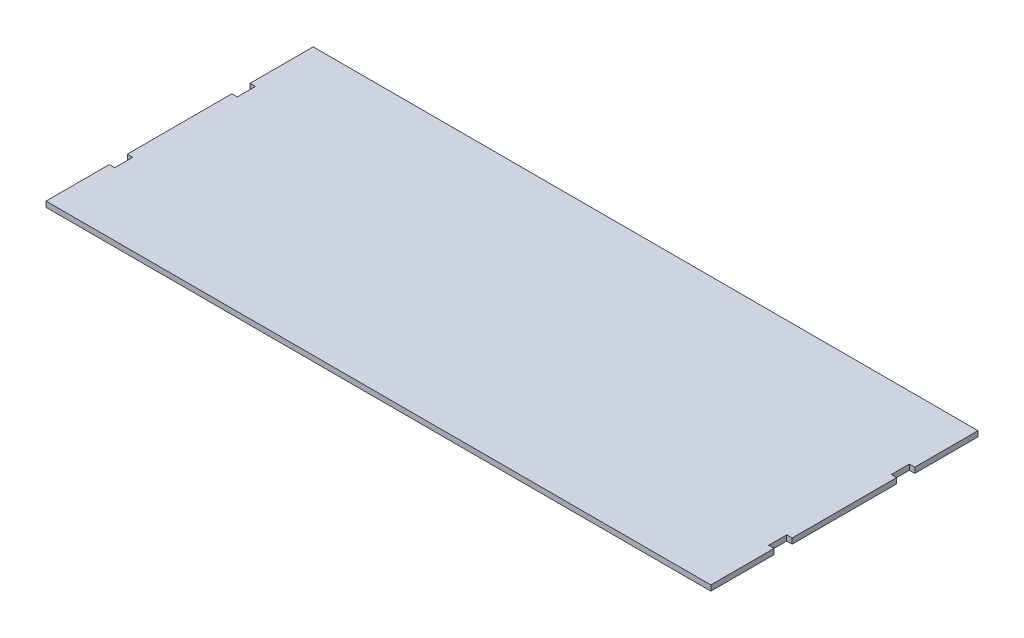
ISO-10303-21;
HEADER;
FILE_DESCRIPTION(('STEP AP214'),'2;1');
FILE_NAME('part.step','',(''),(''),'','','');
FILE_SCHEMA(('AUTOMOTIVE_DESIGN { 1 0 10303 214 1 1 1 1 }'));
ENDSEC;
DATA;
#1=APPLICATION_CONTEXT('core data for automotive mechanical design processes');
#2=APPLICATION_PROTOCOL_DEFINITION('international standard','automotive_design',2000,#1);
#3=PRODUCT_CONTEXT('',#1,'mechanical');
#4=PRODUCT('Part','Part','',(#3));
#5=PRODUCT_RELATED_PRODUCT_CATEGORY('part','',(#4));
#6=PRODUCT_DEFINITION_FORMATION('','',#4);
#7=PRODUCT_DEFINITION_CONTEXT('part definition',#1,'design');
#8=PRODUCT_DEFINITION('design','',#6,#7);
#9=PRODUCT_DEFINITION_SHAPE('','',#8);
#10=(LENGTH_UNIT() NAMED_UNIT(*) SI_UNIT(.MILLI.,.METRE.));
#11=(NAMED_UNIT(*) PLANE_ANGLE_UNIT() SI_UNIT($,.RADIAN.));
#12=(NAMED_UNIT(*) SI_UNIT($,.STERADIAN.) SOLID_ANGLE_UNIT());
#13=UNCERTAINTY_MEASURE_WITH_UNIT(LENGTH_MEASURE(1.E-05),#10,'distance_accuracy_value','');
#14=(GEOMETRIC_REPRESENTATION_CONTEXT(3) GLOBAL_UNCERTAINTY_ASSIGNED_CONTEXT((#13)) GLOBAL_UNIT_ASSIGNED_CONTEXT((#10,
#11,#12)) REPRESENTATION_CONTEXT('',''));
#15=CARTESIAN_POINT('',(0.,0.,0.));
#16=DIRECTION('',(0.,0.,1.));
#17=DIRECTION('',(1.,0.,0.));
#18=AXIS2_PLACEMENT_3D('',#15,#16,#17);
#19=CARTESIAN_POINT('',(-184.,3.,-38.945));
#20=DIRECTION('',(1.,0.,0.));
#21=DIRECTION('',(0.,0.,-1.));
#22=AXIS2_PLACEMENT_3D('',#19,#20,#21);
#23=PLANE('',#22);
#24=DIRECTION('',(0.,0.,1.));
#25=VECTOR('',#24,1.);
#26=CARTESIAN_POINT('',(-184.,0.,-38.945));
#27=LINE('',#26,#25);
#28=CARTESIAN_POINT('',(-184.,0.,-73.945));
#29=VERTEX_POINT('',#28);
#30=CARTESIAN_POINT('',(-184.,0.,-38.945));
#31=VERTEX_POINT('',#30);
#32=EDGE_CURVE('E212',#29,#31,#27,.T.);
#33=ORIENTED_EDGE('',*,*,#32,.T.);
#34=DIRECTION('',(0.,-1.,0.));
#35=VECTOR('',#34,1.);
#36=CARTESIAN_POINT('',(-184.,3.,-38.945));
#37=LINE('',#36,#35);
#38=CARTESIAN_POINT('',(-184.,3.,-38.945));
#39=VERTEX_POINT('',#38);
#40=EDGE_CURVE('E11',#39,#31,#37,.T.);
#41=ORIENTED_EDGE('',*,*,#40,.F.);
#42=DIRECTION('',(0.,0.,1.));
#43=VECTOR('',#42,1.);
#44=CARTESIAN_POINT('',(-184.,3.,-38.945));
#45=LINE('',#44,#43);
#46=CARTESIAN_POINT('',(-184.,3.,-73.945));
#47=VERTEX_POINT('',#46);
#48=EDGE_CURVE('E270',#47,#39,#45,.T.);
#49=ORIENTED_EDGE('',*,*,#48,.F.);
#50=DIRECTION('',(0.,-1.,0.));
#51=VECTOR('',#50,1.);
#52=CARTESIAN_POINT('',(-184.,3.,-73.945));
#53=LINE('',#52,#51);
#54=EDGE_CURVE('E208',#47,#29,#53,.T.);
#55=ORIENTED_EDGE('',*,*,#54,.T.);
#56=EDGE_LOOP('',(#33,#41,#49,#55));
#57=FACE_BOUND('',#56,.T.);
#58=ADVANCED_FACE('F39',(#57),#23,.F.);
#59=CARTESIAN_POINT('',(-184.,3.,-38.945));
#60=DIRECTION('',(0.,0.,-1.));
#61=DIRECTION('',(-1.,0.,0.));
#62=AXIS2_PLACEMENT_3D('',#59,#60,#61);
#63=PLANE('',#62);
#64=DIRECTION('',(1.,0.,0.));
#65=VECTOR('',#64,1.);
#66=CARTESIAN_POINT('',(-184.,0.,-38.945));
#67=LINE('',#66,#65);
#68=CARTESIAN_POINT('',(-181.,0.,-38.945));
#69=VERTEX_POINT('',#68);
#70=EDGE_CURVE('E216',#31,#69,#67,.T.);
#71=ORIENTED_EDGE('',*,*,#70,.T.);
#72=DIRECTION('',(0.,-1.,0.));
#73=VECTOR('',#72,1.);
#74=CARTESIAN_POINT('',(-181.,3.,-38.945));
#75=LINE('',#74,#73);
#76=CARTESIAN_POINT('',(-181.,3.,-38.945));
#77=VERTEX_POINT('',#76);
#78=EDGE_CURVE('E48',#77,#69,#75,.T.);
#79=ORIENTED_EDGE('',*,*,#78,.F.);
#80=DIRECTION('',(1.,0.,0.));
#81=VECTOR('',#80,1.);
#82=CARTESIAN_POINT('',(-184.,3.,-38.945));
#83=LINE('',#82,#81);
#84=EDGE_CURVE('E135',#39,#77,#83,.T.);
#85=ORIENTED_EDGE('',*,*,#84,.F.);
#86=ORIENTED_EDGE('',*,*,#40,.T.);
#87=EDGE_LOOP('',(#71,#79,#85,#86));
#88=FACE_BOUND('',#87,.T.);
#89=ADVANCED_FACE('F420',(#88),#63,.F.);
#90=CARTESIAN_POINT('',(-181.,3.,-38.945));
#91=DIRECTION('',(1.,0.,0.));
#92=DIRECTION('',(0.,0.,-1.));
#93=AXIS2_PLACEMENT_3D('',#90,#91,#92);
#94=PLANE('',#93);
#95=DIRECTION('',(0.,0.,1.));
#96=VECTOR('',#95,1.);
#97=CARTESIAN_POINT('',(-181.,0.,-38.945));
#98=LINE('',#97,#96);
#99=CARTESIAN_POINT('',(-181.,0.,-28.945));
#100=VERTEX_POINT('',#99);
#101=EDGE_CURVE('E219',#69,#100,#98,.T.);
#102=ORIENTED_EDGE('',*,*,#101,.T.);
#103=DIRECTION('',(0.,-1.,0.));
#104=VECTOR('',#103,1.);
#105=CARTESIAN_POINT('',(-181.,3.,-28.945));
#106=LINE('',#105,#104);
#107=CARTESIAN_POINT('',(-181.,3.,-28.945));
#108=VERTEX_POINT('',#107);
#109=EDGE_CURVE('E329',#108,#100,#106,.T.);
#110=ORIENTED_EDGE('',*,*,#109,.F.);
#111=DIRECTION('',(0.,0.,1.));
#112=VECTOR('',#111,1.);
#113=CARTESIAN_POINT('',(-181.,3.,-38.945));
#114=LINE('',#113,#112);
#115=EDGE_CURVE('E339',#77,#108,#114,.T.);
#116=ORIENTED_EDGE('',*,*,#115,.F.);
#117=ORIENTED_EDGE('',*,*,#78,.T.);
#118=EDGE_LOOP('',(#102,#110,#116,#117));
#119=FACE_BOUND('',#118,.T.);
#120=ADVANCED_FACE('F337',(#119),#94,.F.);
#121=CARTESIAN_POINT('',(-181.,3.,-28.945));
#122=DIRECTION('',(0.,0.,1.));
#123=DIRECTION('',(1.,0.,0.));
#124=AXIS2_PLACEMENT_3D('',#121,#122,#123);
#125=PLANE('',#124);
#126=DIRECTION('',(-1.,0.,0.));
#127=VECTOR('',#126,1.);
#128=CARTESIAN_POINT('',(-181.,0.,-28.945));
#129=LINE('',#128,#127);
#130=CARTESIAN_POINT('',(-184.,0.,-28.945));
#131=VERTEX_POINT('',#130);
#132=EDGE_CURVE('E222',#100,#131,#129,.T.);
#133=ORIENTED_EDGE('',*,*,#132,.T.);
#134=DIRECTION('',(0.,-1.,0.));
#135=VECTOR('',#134,1.);
#136=CARTESIAN_POINT('',(-184.,3.,-28.945));
#137=LINE('',#136,#135);
#138=CARTESIAN_POINT('',(-184.,3.,-28.945));
#139=VERTEX_POINT('',#138);
#140=EDGE_CURVE('E325',#139,#131,#137,.T.);
#141=ORIENTED_EDGE('',*,*,#140,.F.);
#142=DIRECTION('',(-1.,0.,0.));
#143=VECTOR('',#142,1.);
#144=CARTESIAN_POINT('',(-181.,3.,-28.945));
#145=LINE('',#144,#143);
#146=EDGE_CURVE('E358',#108,#139,#145,.T.);
#147=ORIENTED_EDGE('',*,*,#146,.F.);
#148=ORIENTED_EDGE('',*,*,#109,.T.);
#149=EDGE_LOOP('',(#133,#141,#147,#148));
#150=FACE_BOUND('',#149,.T.);
#151=ADVANCED_FACE('F348',(#150),#125,.F.);
#152=CARTESIAN_POINT('',(-184.,3.,28.945));
#153=DIRECTION('',(1.,0.,0.));
#154=DIRECTION('',(0.,0.,-1.));
#155=AXIS2_PLACEMENT_3D('',#152,#153,#154);
#156=PLANE('',#155);
#157=DIRECTION('',(0.,0.,1.));
#158=VECTOR('',#157,1.);
#159=CARTESIAN_POINT('',(-184.,0.,28.945));
#160=LINE('',#159,#158);
#161=CARTESIAN_POINT('',(-184.,0.,28.945));
#162=VERTEX_POINT('',#161);
#163=EDGE_CURVE('E225',#131,#162,#160,.T.);
#164=ORIENTED_EDGE('',*,*,#163,.T.);
#165=DIRECTION('',(0.,-1.,0.));
#166=VECTOR('',#165,1.);
#167=CARTESIAN_POINT('',(-184.,3.,28.945));
#168=LINE('',#167,#166);
#169=CARTESIAN_POINT('',(-184.,3.,28.945));
#170=VERTEX_POINT('',#169);
#171=EDGE_CURVE('E321',#170,#162,#168,.T.);
#172=ORIENTED_EDGE('',*,*,#171,.F.);
#173=DIRECTION('',(0.,0.,1.));
#174=VECTOR('',#173,1.);
#175=CARTESIAN_POINT('',(-184.,3.,28.945));
#176=LINE('',#175,#174);
#177=EDGE_CURVE('E354',#139,#170,#176,.T.);
#178=ORIENTED_EDGE('',*,*,#177,.F.);
#179=ORIENTED_EDGE('',*,*,#140,.T.);
#180=EDGE_LOOP('',(#164,#172,#178,#179));
#181=FACE_BOUND('',#180,.T.);
#182=ADVANCED_FACE('F352',(#181),#156,.F.);
#183=CARTESIAN_POINT('',(-181.,3.,28.945));
#184=DIRECTION('',(0.,0.,-1.));
#185=DIRECTION('',(-1.,0.,0.));
#186=AXIS2_PLACEMENT_3D('',#183,#184,#185);
#187=PLANE('',#186);
#188=DIRECTION('',(1.,0.,0.));
#189=VECTOR('',#188,1.);
#190=CARTESIAN_POINT('',(-181.,0.,28.945));
#191=LINE('',#190,#189);
#192=CARTESIAN_POINT('',(-181.,0.,28.945));
#193=VERTEX_POINT('',#192);
#194=EDGE_CURVE('E228',#162,#193,#191,.T.);
#195=ORIENTED_EDGE('',*,*,#194,.T.);
#196=DIRECTION('',(0.,-1.,0.));
#197=VECTOR('',#196,1.);
#198=CARTESIAN_POINT('',(-181.,3.,28.945));
#199=LINE('',#198,#197);
#200=CARTESIAN_POINT('',(-181.,3.,28.945));
#201=VERTEX_POINT('',#200);
#202=EDGE_CURVE('E317',#201,#193,#199,.T.);
#203=ORIENTED_EDGE('',*,*,#202,.F.);
#204=DIRECTION('',(1.,0.,0.));
#205=VECTOR('',#204,1.);
#206=CARTESIAN_POINT('',(-181.,3.,28.945));
#207=LINE('',#206,#205);
#208=EDGE_CURVE('E357',#170,#201,#207,.T.);
#209=ORIENTED_EDGE('',*,*,#208,.F.);
#210=ORIENTED_EDGE('',*,*,#171,.T.);
#211=EDGE_LOOP('',(#195,#203,#209,#210));
#212=FACE_BOUND('',#211,.T.);
#213=ADVANCED_FACE('F433',(#212),#187,.F.);
#214=CARTESIAN_POINT('',(-181.,3.,38.945));
#215=DIRECTION('',(1.,0.,0.));
#216=DIRECTION('',(0.,0.,-1.));
#217=AXIS2_PLACEMENT_3D('',#214,#215,#216);
#218=PLANE('',#217);
#219=DIRECTION('',(0.,0.,1.));
#220=VECTOR('',#219,1.);
#221=CARTESIAN_POINT('',(-181.,0.,38.945));
#222=LINE('',#221,#220);
#223=CARTESIAN_POINT('',(-181.,0.,38.945));
#224=VERTEX_POINT('',#223);
#225=EDGE_CURVE('E231',#193,#224,#222,.T.);
#226=ORIENTED_EDGE('',*,*,#225,.T.);
#227=DIRECTION('',(0.,-1.,0.));
#228=VECTOR('',#227,1.);
#229=CARTESIAN_POINT('',(-181.,3.,38.945));
#230=LINE('',#229,#228);
#231=CARTESIAN_POINT('',(-181.,3.,38.945));
#232=VERTEX_POINT('',#231);
#233=EDGE_CURVE('E313',#232,#224,#230,.T.);
#234=ORIENTED_EDGE('',*,*,#233,.F.);
#235=DIRECTION('',(0.,0.,1.));
#236=VECTOR('',#235,1.);
#237=CARTESIAN_POINT('',(-181.,3.,38.945));
#238=LINE('',#237,#236);
#239=EDGE_CURVE('E362',#201,#232,#238,.T.);
#240=ORIENTED_EDGE('',*,*,#239,.F.);
#241=ORIENTED_EDGE('',*,*,#202,.T.);
#242=EDGE_LOOP('',(#226,#234,#240,#241));
#243=FACE_BOUND('',#242,.T.);
#244=ADVANCED_FACE('F436',(#243),#218,.F.);
#245=CARTESIAN_POINT('',(-184.,3.,38.945));
#246=DIRECTION('',(0.,0.,1.));
#247=DIRECTION('',(1.,0.,0.));
#248=AXIS2_PLACEMENT_3D('',#245,#246,#247);
#249=PLANE('',#248);
#250=DIRECTION('',(-1.,0.,0.));
#251=VECTOR('',#250,1.);
#252=CARTESIAN_POINT('',(-184.,0.,38.945));
#253=LINE('',#252,#251);
#254=CARTESIAN_POINT('',(-184.,0.,38.945));
#255=VERTEX_POINT('',#254);
#256=EDGE_CURVE('E234',#224,#255,#253,.T.);
#257=ORIENTED_EDGE('',*,*,#256,.T.);
#258=DIRECTION('',(0.,-1.,0.));
#259=VECTOR('',#258,1.);
#260=CARTESIAN_POINT('',(-184.,3.,38.945));
#261=LINE('',#260,#259);
#262=CARTESIAN_POINT('',(-184.,3.,38.945));
#263=VERTEX_POINT('',#262);
#264=EDGE_CURVE('E309',#263,#255,#261,.T.);
#265=ORIENTED_EDGE('',*,*,#264,.F.);
#266=DIRECTION('',(-1.,0.,0.));
#267=VECTOR('',#266,1.);
#268=CARTESIAN_POINT('',(-184.,3.,38.945));
#269=LINE('',#268,#267);
#270=EDGE_CURVE('E369',#232,#263,#269,.T.);
#271=ORIENTED_EDGE('',*,*,#270,.F.);
#272=ORIENTED_EDGE('',*,*,#233,.T.);
#273=EDGE_LOOP('',(#257,#265,#271,#272));
#274=FACE_BOUND('',#273,.T.);
#275=ADVANCED_FACE('F440',(#274),#249,.F.);
#276=CARTESIAN_POINT('',(-184.,3.,73.945));
#277=DIRECTION('',(1.,0.,0.));
#278=DIRECTION('',(0.,0.,-1.));
#279=AXIS2_PLACEMENT_3D('',#276,#277,#278);
#280=PLANE('',#279);
#281=DIRECTION('',(0.,0.,1.));
#282=VECTOR('',#281,1.);
#283=CARTESIAN_POINT('',(-184.,0.,73.945));
#284=LINE('',#283,#282);
#285=CARTESIAN_POINT('',(-184.,0.,73.945));
#286=VERTEX_POINT('',#285);
#287=EDGE_CURVE('E237',#255,#286,#284,.T.);
#288=ORIENTED_EDGE('',*,*,#287,.T.);
#289=DIRECTION('',(0.,-1.,0.));
#290=VECTOR('',#289,1.);
#291=CARTESIAN_POINT('',(-184.,3.,73.945));
#292=LINE('',#291,#290);
#293=CARTESIAN_POINT('',(-184.,3.,73.945));
#294=VERTEX_POINT('',#293);
#295=EDGE_CURVE('E305',#294,#286,#292,.T.);
#296=ORIENTED_EDGE('',*,*,#295,.F.);
#297=DIRECTION('',(0.,0.,1.));
#298=VECTOR('',#297,1.);
#299=CARTESIAN_POINT('',(-184.,3.,73.945));
#300=LINE('',#299,#298);
#301=EDGE_CURVE('E372',#263,#294,#300,.T.);
#302=ORIENTED_EDGE('',*,*,#301,.F.);
#303=ORIENTED_EDGE('',*,*,#264,.T.);
#304=EDGE_LOOP('',(#288,#296,#302,#303));
#305=FACE_BOUND('',#304,.T.);
#306=ADVANCED_FACE('F444',(#305),#280,.F.);
#307=CARTESIAN_POINT('',(184.,3.,73.945));
#308=DIRECTION('',(0.,0.,-1.));
#309=DIRECTION('',(-1.,0.,0.));
#310=AXIS2_PLACEMENT_3D('',#307,#308,#309);
#311=PLANE('',#310);
#312=DIRECTION('',(1.,0.,0.));
#313=VECTOR('',#312,1.);
#314=CARTESIAN_POINT('',(184.,0.,73.945));
#315=LINE('',#314,#313);
#316=CARTESIAN_POINT('',(184.,0.,73.945));
#317=VERTEX_POINT('',#316);
#318=EDGE_CURVE('E240',#286,#317,#315,.T.);
#319=ORIENTED_EDGE('',*,*,#318,.T.);
#320=DIRECTION('',(0.,-1.,0.));
#321=VECTOR('',#320,1.);
#322=CARTESIAN_POINT('',(184.,3.,73.945));
#323=LINE('',#322,#321);
#324=CARTESIAN_POINT('',(184.,3.,73.945));
#325=VERTEX_POINT('',#324);
#326=EDGE_CURVE('E301',#325,#317,#323,.T.);
#327=ORIENTED_EDGE('',*,*,#326,.F.);
#328=DIRECTION('',(1.,0.,0.));
#329=VECTOR('',#328,1.);
#330=CARTESIAN_POINT('',(184.,3.,73.945));
#331=LINE('',#330,#329);
#332=EDGE_CURVE('E375',#294,#325,#331,.T.);
#333=ORIENTED_EDGE('',*,*,#332,.F.);
#334=ORIENTED_EDGE('',*,*,#295,.T.);
#335=EDGE_LOOP('',(#319,#327,#333,#334));
#336=FACE_BOUND('',#335,.T.);
#337=ADVANCED_FACE('F448',(#336),#311,.F.);
#338=CARTESIAN_POINT('',(184.,3.,73.945));
#339=DIRECTION('',(-1.,0.,0.));
#340=DIRECTION('',(0.,0.,1.));
#341=AXIS2_PLACEMENT_3D('',#338,#339,#340);
#342=PLANE('',#341);
#343=DIRECTION('',(0.,0.,-1.));
#344=VECTOR('',#343,1.);
#345=CARTESIAN_POINT('',(184.,0.,73.945));
#346=LINE('',#345,#344);
#347=CARTESIAN_POINT('',(184.,0.,38.945));
#348=VERTEX_POINT('',#347);
#349=EDGE_CURVE('E243',#317,#348,#346,.T.);
#350=ORIENTED_EDGE('',*,*,#349,.T.);
#351=DIRECTION('',(0.,-1.,0.));
#352=VECTOR('',#351,1.);
#353=CARTESIAN_POINT('',(184.,3.,38.945));
#354=LINE('',#353,#352);
#355=CARTESIAN_POINT('',(184.,3.,38.945));
#356=VERTEX_POINT('',#355);
#357=EDGE_CURVE('E297',#356,#348,#354,.T.);
#358=ORIENTED_EDGE('',*,*,#357,.F.);
#359=DIRECTION('',(0.,0.,-1.));
#360=VECTOR('',#359,1.);
#361=CARTESIAN_POINT('',(184.,3.,73.945));
#362=LINE('',#361,#360);
#363=EDGE_CURVE('E378',#325,#356,#362,.T.);
#364=ORIENTED_EDGE('',*,*,#363,.F.);
#365=ORIENTED_EDGE('',*,*,#326,.T.);
#366=EDGE_LOOP('',(#350,#358,#364,#365));
#367=FACE_BOUND('',#366,.T.);
#368=ADVANCED_FACE('F452',(#367),#342,.F.);
#369=CARTESIAN_POINT('',(184.,3.,38.945));
#370=DIRECTION('',(0.,0.,1.));
#371=DIRECTION('',(1.,0.,0.));
#372=AXIS2_PLACEMENT_3D('',#369,#370,#371);
#373=PLANE('',#372);
#374=DIRECTION('',(-1.,0.,0.));
#375=VECTOR('',#374,1.);
#376=CARTESIAN_POINT('',(184.,0.,38.945));
#377=LINE('',#376,#375);
#378=CARTESIAN_POINT('',(181.,0.,38.945));
#379=VERTEX_POINT('',#378);
#380=EDGE_CURVE('E246',#348,#379,#377,.T.);
#381=ORIENTED_EDGE('',*,*,#380,.T.);
#382=DIRECTION('',(0.,-1.,0.));
#383=VECTOR('',#382,1.);
#384=CARTESIAN_POINT('',(181.,3.,38.945));
#385=LINE('',#384,#383);
#386=CARTESIAN_POINT('',(181.,3.,38.945));
#387=VERTEX_POINT('',#386);
#388=EDGE_CURVE('E293',#387,#379,#385,.T.);
#389=ORIENTED_EDGE('',*,*,#388,.F.);
#390=DIRECTION('',(-1.,0.,0.));
#391=VECTOR('',#390,1.);
#392=CARTESIAN_POINT('',(184.,3.,38.945));
#393=LINE('',#392,#391);
#394=EDGE_CURVE('E381',#356,#387,#393,.T.);
#395=ORIENTED_EDGE('',*,*,#394,.F.);
#396=ORIENTED_EDGE('',*,*,#357,.T.);
#397=EDGE_LOOP('',(#381,#389,#395,#396));
#398=FACE_BOUND('',#397,.T.);
#399=ADVANCED_FACE('F456',(#398),#373,.F.);
#400=CARTESIAN_POINT('',(181.,3.,38.945));
#401=DIRECTION('',(-1.,0.,0.));
#402=DIRECTION('',(0.,0.,1.));
#403=AXIS2_PLACEMENT_3D('',#400,#401,#402);
#404=PLANE('',#403);
#405=DIRECTION('',(0.,0.,-1.));
#406=VECTOR('',#405,1.);
#407=CARTESIAN_POINT('',(181.,0.,38.945));
#408=LINE('',#407,#406);
#409=CARTESIAN_POINT('',(181.,0.,28.945));
#410=VERTEX_POINT('',#409);
#411=EDGE_CURVE('E249',#379,#410,#408,.T.);
#412=ORIENTED_EDGE('',*,*,#411,.T.);
#413=DIRECTION('',(0.,-1.,0.));
#414=VECTOR('',#413,1.);
#415=CARTESIAN_POINT('',(181.,3.,28.945));
#416=LINE('',#415,#414);
#417=CARTESIAN_POINT('',(181.,3.,28.945));
#418=VERTEX_POINT('',#417);
#419=EDGE_CURVE('E289',#418,#410,#416,.T.);
#420=ORIENTED_EDGE('',*,*,#419,.F.);
#421=DIRECTION('',(0.,0.,-1.));
#422=VECTOR('',#421,1.);
#423=CARTESIAN_POINT('',(181.,3.,38.945));
#424=LINE('',#423,#422);
#425=EDGE_CURVE('E384',#387,#418,#424,.T.);
#426=ORIENTED_EDGE('',*,*,#425,.F.);
#427=ORIENTED_EDGE('',*,*,#388,.T.);
#428=EDGE_LOOP('',(#412,#420,#426,#427));
#429=FACE_BOUND('',#428,.T.);
#430=ADVANCED_FACE('F460',(#429),#404,.F.);
#431=CARTESIAN_POINT('',(181.,3.,28.945));
#432=DIRECTION('',(0.,0.,-1.));
#433=DIRECTION('',(-1.,0.,0.));
#434=AXIS2_PLACEMENT_3D('',#431,#432,#433);
#435=PLANE('',#434);
#436=DIRECTION('',(1.,0.,0.));
#437=VECTOR('',#436,1.);
#438=CARTESIAN_POINT('',(181.,0.,28.945));
#439=LINE('',#438,#437);
#440=CARTESIAN_POINT('',(184.,0.,28.945));
#441=VERTEX_POINT('',#440);
#442=EDGE_CURVE('E252',#410,#441,#439,.T.);
#443=ORIENTED_EDGE('',*,*,#442,.T.);
#444=DIRECTION('',(0.,-1.,0.));
#445=VECTOR('',#444,1.);
#446=CARTESIAN_POINT('',(184.,3.,28.945));
#447=LINE('',#446,#445);
#448=CARTESIAN_POINT('',(184.,3.,28.945));
#449=VERTEX_POINT('',#448);
#450=EDGE_CURVE('E285',#449,#441,#447,.T.);
#451=ORIENTED_EDGE('',*,*,#450,.F.);
#452=DIRECTION('',(1.,0.,0.));
#453=VECTOR('',#452,1.);
#454=CARTESIAN_POINT('',(181.,3.,28.945));
#455=LINE('',#454,#453);
#456=EDGE_CURVE('E387',#418,#449,#455,.T.);
#457=ORIENTED_EDGE('',*,*,#456,.F.);
#458=ORIENTED_EDGE('',*,*,#419,.T.);
#459=EDGE_LOOP('',(#443,#451,#457,#458));
#460=FACE_BOUND('',#459,.T.);
#461=ADVANCED_FACE('F464',(#460),#435,.F.);
#462=CARTESIAN_POINT('',(184.,3.,28.945));
#463=DIRECTION('',(-1.,0.,0.));
#464=DIRECTION('',(0.,0.,1.));
#465=AXIS2_PLACEMENT_3D('',#462,#463,#464);
#466=PLANE('',#465);
#467=DIRECTION('',(0.,0.,-1.));
#468=VECTOR('',#467,1.);
#469=CARTESIAN_POINT('',(184.,0.,28.945));
#470=LINE('',#469,#468);
#471=CARTESIAN_POINT('',(184.,0.,-28.945));
#472=VERTEX_POINT('',#471);
#473=EDGE_CURVE('E255',#441,#472,#470,.T.);
#474=ORIENTED_EDGE('',*,*,#473,.T.);
#475=DIRECTION('',(0.,-1.,0.));
#476=VECTOR('',#475,1.);
#477=CARTESIAN_POINT('',(184.,3.,-28.945));
#478=LINE('',#477,#476);
#479=CARTESIAN_POINT('',(184.,3.,-28.945));
#480=VERTEX_POINT('',#479);
#481=EDGE_CURVE('E281',#480,#472,#478,.T.);
#482=ORIENTED_EDGE('',*,*,#481,.F.);
#483=DIRECTION('',(0.,0.,-1.));
#484=VECTOR('',#483,1.);
#485=CARTESIAN_POINT('',(184.,3.,28.945));
#486=LINE('',#485,#484);
#487=EDGE_CURVE('E390',#449,#480,#486,.T.);
#488=ORIENTED_EDGE('',*,*,#487,.F.);
#489=ORIENTED_EDGE('',*,*,#450,.T.);
#490=EDGE_LOOP('',(#474,#482,#488,#489));
#491=FACE_BOUND('',#490,.T.);
#492=ADVANCED_FACE('F468',(#491),#466,.F.);
#493=CARTESIAN_POINT('',(181.,3.,-28.945));
#494=DIRECTION('',(0.,0.,1.));
#495=DIRECTION('',(1.,0.,0.));
#496=AXIS2_PLACEMENT_3D('',#493,#494,#495);
#497=PLANE('',#496);
#498=DIRECTION('',(-1.,0.,0.));
#499=VECTOR('',#498,1.);
#500=CARTESIAN_POINT('',(181.,0.,-28.945));
#501=LINE('',#500,#499);
#502=CARTESIAN_POINT('',(181.,0.,-28.945));
#503=VERTEX_POINT('',#502);
#504=EDGE_CURVE('E258',#472,#503,#501,.T.);
#505=ORIENTED_EDGE('',*,*,#504,.T.);
#506=DIRECTION('',(0.,-1.,0.));
#507=VECTOR('',#506,1.);
#508=CARTESIAN_POINT('',(181.,3.,-28.945));
#509=LINE('',#508,#507);
#510=CARTESIAN_POINT('',(181.,3.,-28.945));
#511=VERTEX_POINT('',#510);
#512=EDGE_CURVE('E277',#511,#503,#509,.T.);
#513=ORIENTED_EDGE('',*,*,#512,.F.);
#514=DIRECTION('',(-1.,0.,0.));
#515=VECTOR('',#514,1.);
#516=CARTESIAN_POINT('',(181.,3.,-28.945));
#517=LINE('',#516,#515);
#518=EDGE_CURVE('E393',#480,#511,#517,.T.);
#519=ORIENTED_EDGE('',*,*,#518,.F.);
#520=ORIENTED_EDGE('',*,*,#481,.T.);
#521=EDGE_LOOP('',(#505,#513,#519,#520));
#522=FACE_BOUND('',#521,.T.);
#523=ADVANCED_FACE('F401',(#522),#497,.F.);
#524=CARTESIAN_POINT('',(181.,3.,-38.945));
#525=DIRECTION('',(-1.,0.,0.));
#526=DIRECTION('',(0.,0.,1.));
#527=AXIS2_PLACEMENT_3D('',#524,#525,#526);
#528=PLANE('',#527);
#529=DIRECTION('',(0.,0.,-1.));
#530=VECTOR('',#529,1.);
#531=CARTESIAN_POINT('',(181.,0.,-38.945));
#532=LINE('',#531,#530);
#533=CARTESIAN_POINT('',(181.,0.,-38.945));
#534=VERTEX_POINT('',#533);
#535=EDGE_CURVE('E261',#503,#534,#532,.T.);
#536=ORIENTED_EDGE('',*,*,#535,.T.);
#537=DIRECTION('',(0.,-1.,0.));
#538=VECTOR('',#537,1.);
#539=CARTESIAN_POINT('',(181.,3.,-38.945));
#540=LINE('',#539,#538);
#541=CARTESIAN_POINT('',(181.,3.,-38.945));
#542=VERTEX_POINT('',#541);
#543=EDGE_CURVE('E201',#542,#534,#540,.T.);
#544=ORIENTED_EDGE('',*,*,#543,.F.);
#545=DIRECTION('',(0.,0.,-1.));
#546=VECTOR('',#545,1.);
#547=CARTESIAN_POINT('',(181.,3.,-38.945));
#548=LINE('',#547,#546);
#549=EDGE_CURVE('E190',#511,#542,#548,.T.);
#550=ORIENTED_EDGE('',*,*,#549,.F.);
#551=ORIENTED_EDGE('',*,*,#512,.T.);
#552=EDGE_LOOP('',(#536,#544,#550,#551));
#553=FACE_BOUND('',#552,.T.);
#554=ADVANCED_FACE('F405',(#553),#528,.F.);
#555=CARTESIAN_POINT('',(184.,3.,-38.945));
#556=DIRECTION('',(0.,0.,-1.));
#557=DIRECTION('',(-1.,0.,0.));
#558=AXIS2_PLACEMENT_3D('',#555,#556,#557);
#559=PLANE('',#558);
#560=DIRECTION('',(1.,0.,0.));
#561=VECTOR('',#560,1.);
#562=CARTESIAN_POINT('',(184.,0.,-38.945));
#563=LINE('',#562,#561);
#564=CARTESIAN_POINT('',(184.,0.,-38.945));
#565=VERTEX_POINT('',#564);
#566=EDGE_CURVE('E199',#534,#565,#563,.T.);
#567=ORIENTED_EDGE('',*,*,#566,.T.);
#568=DIRECTION('',(0.,-1.,0.));
#569=VECTOR('',#568,1.);
#570=CARTESIAN_POINT('',(184.,3.,-38.945));
#571=LINE('',#570,#569);
#572=CARTESIAN_POINT('',(184.,3.,-38.945));
#573=VERTEX_POINT('',#572);
#574=EDGE_CURVE('E196',#573,#565,#571,.T.);
#575=ORIENTED_EDGE('',*,*,#574,.F.);
#576=DIRECTION('',(1.,0.,0.));
#577=VECTOR('',#576,1.);
#578=CARTESIAN_POINT('',(184.,3.,-38.945));
#579=LINE('',#578,#577);
#580=EDGE_CURVE('E184',#542,#573,#579,.T.);
#581=ORIENTED_EDGE('',*,*,#580,.F.);
#582=ORIENTED_EDGE('',*,*,#543,.T.);
#583=EDGE_LOOP('',(#567,#575,#581,#582));
#584=FACE_BOUND('',#583,.T.);
#585=ADVANCED_FACE('F197',(#584),#559,.F.);
#586=CARTESIAN_POINT('',(184.,3.,-38.945));
#587=DIRECTION('',(-1.,0.,0.));
#588=DIRECTION('',(0.,0.,1.));
#589=AXIS2_PLACEMENT_3D('',#586,#587,#588);
#590=PLANE('',#589);
#591=DIRECTION('',(0.,0.,-1.));
#592=VECTOR('',#591,1.);
#593=CARTESIAN_POINT('',(184.,0.,-38.945));
#594=LINE('',#593,#592);
#595=CARTESIAN_POINT('',(184.,0.,-73.945));
#596=VERTEX_POINT('',#595);
#597=EDGE_CURVE('E121',#565,#596,#594,.T.);
#598=ORIENTED_EDGE('',*,*,#597,.T.);
#599=DIRECTION('',(0.,-1.,0.));
#600=VECTOR('',#599,1.);
#601=CARTESIAN_POINT('',(184.,3.,-73.945));
#602=LINE('',#601,#600);
#603=CARTESIAN_POINT('',(184.,3.,-73.945));
#604=VERTEX_POINT('',#603);
#605=EDGE_CURVE('E202',#604,#596,#602,.T.);
#606=ORIENTED_EDGE('',*,*,#605,.F.);
#607=DIRECTION('',(0.,0.,-1.));
#608=VECTOR('',#607,1.);
#609=CARTESIAN_POINT('',(184.,3.,-38.945));
#610=LINE('',#609,#608);
#611=EDGE_CURVE('E188',#573,#604,#610,.T.);
#612=ORIENTED_EDGE('',*,*,#611,.F.);
#613=ORIENTED_EDGE('',*,*,#574,.T.);
#614=EDGE_LOOP('',(#598,#606,#612,#613));
#615=FACE_BOUND('',#614,.T.);
#616=ADVANCED_FACE('F204',(#615),#590,.F.);
#617=CARTESIAN_POINT('',(184.,3.,-73.945));
#618=DIRECTION('',(0.,0.,1.));
#619=DIRECTION('',(1.,0.,0.));
#620=AXIS2_PLACEMENT_3D('',#617,#618,#619);
#621=PLANE('',#620);
#622=DIRECTION('',(-1.,0.,0.));
#623=VECTOR('',#622,1.);
#624=CARTESIAN_POINT('',(184.,0.,-73.945));
#625=LINE('',#624,#623);
#626=EDGE_CURVE('E127',#596,#29,#625,.T.);
#627=ORIENTED_EDGE('',*,*,#626,.T.);
#628=ORIENTED_EDGE('',*,*,#54,.F.);
#629=DIRECTION('',(-1.,0.,0.));
#630=VECTOR('',#629,1.);
#631=CARTESIAN_POINT('',(184.,3.,-73.945));
#632=LINE('',#631,#630);
#633=EDGE_CURVE('E56',#604,#47,#632,.T.);
#634=ORIENTED_EDGE('',*,*,#633,.F.);
#635=ORIENTED_EDGE('',*,*,#605,.T.);
#636=EDGE_LOOP('',(#627,#628,#634,#635));
#637=FACE_BOUND('',#636,.T.);
#638=ADVANCED_FACE('F409',(#637),#621,.F.);
#639=CARTESIAN_POINT('',(0.,3.,0.));
#640=DIRECTION('',(0.,1.,0.));
#641=DIRECTION('',(0.,0.,1.));
#642=AXIS2_PLACEMENT_3D('',#639,#640,#641);
#643=PLANE('',#642);
#644=ORIENTED_EDGE('',*,*,#48,.T.);
#645=ORIENTED_EDGE('',*,*,#84,.T.);
#646=ORIENTED_EDGE('',*,*,#115,.T.);
#647=ORIENTED_EDGE('',*,*,#146,.T.);
#648=ORIENTED_EDGE('',*,*,#177,.T.);
#649=ORIENTED_EDGE('',*,*,#208,.T.);
#650=ORIENTED_EDGE('',*,*,#239,.T.);
#651=ORIENTED_EDGE('',*,*,#270,.T.);
#652=ORIENTED_EDGE('',*,*,#301,.T.);
#653=ORIENTED_EDGE('',*,*,#332,.T.);
#654=ORIENTED_EDGE('',*,*,#363,.T.);
#655=ORIENTED_EDGE('',*,*,#394,.T.);
#656=ORIENTED_EDGE('',*,*,#425,.T.);
#657=ORIENTED_EDGE('',*,*,#456,.T.);
#658=ORIENTED_EDGE('',*,*,#487,.T.);
#659=ORIENTED_EDGE('',*,*,#518,.T.);
#660=ORIENTED_EDGE('',*,*,#549,.T.);
#661=ORIENTED_EDGE('',*,*,#580,.T.);
#662=ORIENTED_EDGE('',*,*,#611,.T.);
#663=ORIENTED_EDGE('',*,*,#633,.T.);
#664=EDGE_LOOP('',(#644,#645,#646,#647,#648,#649,#650,#651,#652,#653,#654,#655,#656,#657,#658,
#659,#660,#661,#662,#663));
#665=FACE_BOUND('',#664,.T.);
#666=ADVANCED_FACE('F186',(#665),#643,.T.);
#667=CARTESIAN_POINT('',(0.,0.,0.));
#668=DIRECTION('',(0.,1.,0.));
#669=DIRECTION('',(0.,0.,1.));
#670=AXIS2_PLACEMENT_3D('',#667,#668,#669);
#671=PLANE('',#670);
#672=ORIENTED_EDGE('',*,*,#32,.F.);
#673=ORIENTED_EDGE('',*,*,#626,.F.);
#674=ORIENTED_EDGE('',*,*,#597,.F.);
#675=ORIENTED_EDGE('',*,*,#566,.F.);
#676=ORIENTED_EDGE('',*,*,#535,.F.);
#677=ORIENTED_EDGE('',*,*,#504,.F.);
#678=ORIENTED_EDGE('',*,*,#473,.F.);
#679=ORIENTED_EDGE('',*,*,#442,.F.);
#680=ORIENTED_EDGE('',*,*,#411,.F.);
#681=ORIENTED_EDGE('',*,*,#380,.F.);
#682=ORIENTED_EDGE('',*,*,#349,.F.);
#683=ORIENTED_EDGE('',*,*,#318,.F.);
#684=ORIENTED_EDGE('',*,*,#287,.F.);
#685=ORIENTED_EDGE('',*,*,#256,.F.);
#686=ORIENTED_EDGE('',*,*,#225,.F.);
#687=ORIENTED_EDGE('',*,*,#194,.F.);
#688=ORIENTED_EDGE('',*,*,#163,.F.);
#689=ORIENTED_EDGE('',*,*,#132,.F.);
#690=ORIENTED_EDGE('',*,*,#101,.F.);
#691=ORIENTED_EDGE('',*,*,#70,.F.);
#692=EDGE_LOOP('',(#672,#673,#674,#675,#676,#677,#678,#679,#680,#681,#682,#683,#684,#685,#686,
#687,#688,#689,#690,#691));
#693=FACE_BOUND('',#692,.T.);
#694=ADVANCED_FACE('F343',(#693),#671,.F.);
#695=CLOSED_SHELL('',(#58,#89,#120,#151,#182,#213,#244,#275,#306,#337,#368,#399,#430,#461,#492,
#523,#554,#585,#616,#638,#666,#694));
#696=MANIFOLD_SOLID_BREP('B2',#695);
#697=ADVANCED_BREP_SHAPE_REPRESENTATION('',(#18,#696),#14);
#698=SHAPE_DEFINITION_REPRESENTATION(#9,#697);
ENDSEC;
END-ISO-10303-21;
